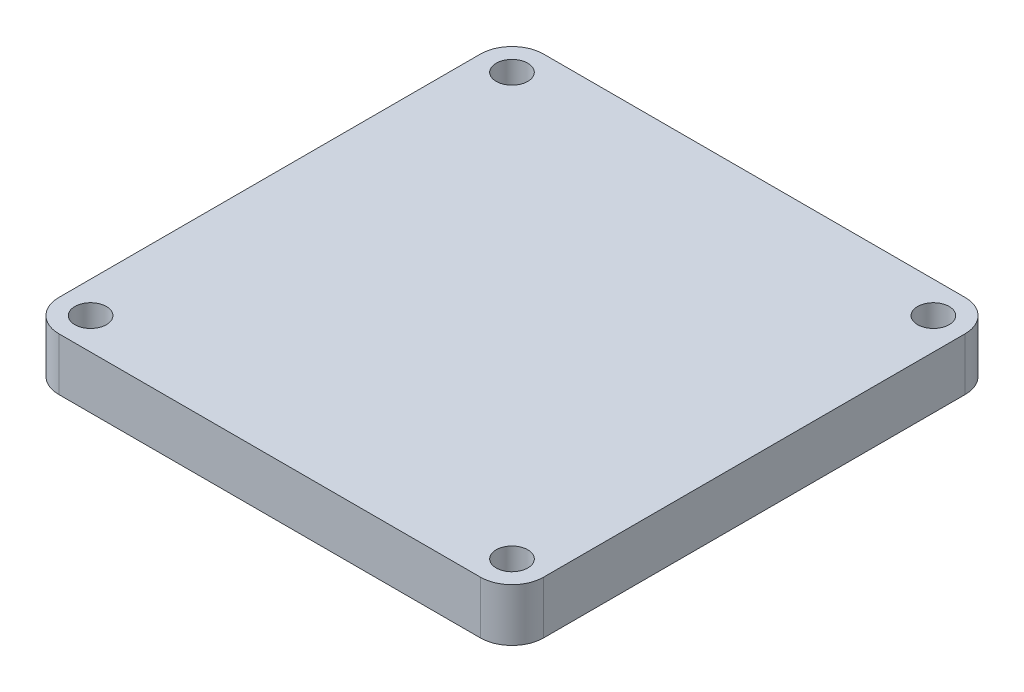
ISO-10303-21;
HEADER;
FILE_DESCRIPTION(('STEP AP214'),'2;1');
FILE_NAME('part.step','',(''),(''),'','','');
FILE_SCHEMA(('AUTOMOTIVE_DESIGN { 1 0 10303 214 1 1 1 1 }'));
ENDSEC;
DATA;
#1=APPLICATION_CONTEXT('core data for automotive mechanical design processes');
#2=APPLICATION_PROTOCOL_DEFINITION('international standard','automotive_design',2000,#1);
#3=PRODUCT_CONTEXT('',#1,'mechanical');
#4=PRODUCT('Part','Part','',(#3));
#5=PRODUCT_RELATED_PRODUCT_CATEGORY('part','',(#4));
#6=PRODUCT_DEFINITION_FORMATION('','',#4);
#7=PRODUCT_DEFINITION_CONTEXT('part definition',#1,'design');
#8=PRODUCT_DEFINITION('design','',#6,#7);
#9=PRODUCT_DEFINITION_SHAPE('','',#8);
#10=(LENGTH_UNIT() NAMED_UNIT(*) SI_UNIT(.MILLI.,.METRE.));
#11=(NAMED_UNIT(*) PLANE_ANGLE_UNIT() SI_UNIT($,.RADIAN.));
#12=(NAMED_UNIT(*) SI_UNIT($,.STERADIAN.) SOLID_ANGLE_UNIT());
#13=UNCERTAINTY_MEASURE_WITH_UNIT(LENGTH_MEASURE(1.E-05),#10,'distance_accuracy_value','');
#14=(GEOMETRIC_REPRESENTATION_CONTEXT(3) GLOBAL_UNCERTAINTY_ASSIGNED_CONTEXT((#13)) GLOBAL_UNIT_ASSIGNED_CONTEXT((#10,
#11,#12)) REPRESENTATION_CONTEXT('',''));
#15=CARTESIAN_POINT('',(0.,0.,0.));
#16=DIRECTION('',(0.,0.,1.));
#17=DIRECTION('',(1.,0.,0.));
#18=AXIS2_PLACEMENT_3D('',#15,#16,#17);
#19=CARTESIAN_POINT('',(-20.,5.,20.));
#20=DIRECTION('',(0.,-1.,0.));
#21=DIRECTION('',(0.,0.,-1.));
#22=AXIS2_PLACEMENT_3D('',#19,#20,#21);
#23=PLANE('',#22);
#24=CARTESIAN_POINT('',(-20.,5.,20.));
#25=DIRECTION('',(0.,1.,0.));
#26=DIRECTION('',(0.,0.,-1.));
#27=AXIS2_PLACEMENT_3D('',#24,#25,#26);
#28=CIRCLE('',#27,3.);
#29=CARTESIAN_POINT('',(-23.,5.,20.));
#30=VERTEX_POINT('',#29);
#31=CARTESIAN_POINT('',(-20.,5.,23.));
#32=VERTEX_POINT('',#31);
#33=EDGE_CURVE('E144',#30,#32,#28,.T.);
#34=ORIENTED_EDGE('',*,*,#33,.T.);
#35=DIRECTION('',(1.,0.,0.));
#36=VECTOR('',#35,1.);
#37=CARTESIAN_POINT('',(20.,5.,23.));
#38=LINE('',#37,#36);
#39=CARTESIAN_POINT('',(20.,5.,23.));
#40=VERTEX_POINT('',#39);
#41=EDGE_CURVE('E92',#32,#40,#38,.T.);
#42=ORIENTED_EDGE('',*,*,#41,.T.);
#43=CARTESIAN_POINT('',(20.,5.,20.));
#44=DIRECTION('',(0.,1.,0.));
#45=DIRECTION('',(0.,0.,1.));
#46=AXIS2_PLACEMENT_3D('',#43,#44,#45);
#47=CIRCLE('',#46,3.);
#48=CARTESIAN_POINT('',(23.,5.,20.));
#49=VERTEX_POINT('',#48);
#50=EDGE_CURVE('E159',#40,#49,#47,.T.);
#51=ORIENTED_EDGE('',*,*,#50,.T.);
#52=DIRECTION('',(0.,0.,-1.));
#53=VECTOR('',#52,1.);
#54=CARTESIAN_POINT('',(23.,5.,20.));
#55=LINE('',#54,#53);
#56=CARTESIAN_POINT('',(23.,5.,-20.));
#57=VERTEX_POINT('',#56);
#58=EDGE_CURVE('E172',#49,#57,#55,.T.);
#59=ORIENTED_EDGE('',*,*,#58,.T.);
#60=CARTESIAN_POINT('',(20.,5.,-20.));
#61=DIRECTION('',(0.,1.,0.));
#62=DIRECTION('',(0.,0.,1.));
#63=AXIS2_PLACEMENT_3D('',#60,#61,#62);
#64=CIRCLE('',#63,3.);
#65=CARTESIAN_POINT('',(20.,5.,-23.));
#66=VERTEX_POINT('',#65);
#67=EDGE_CURVE('E111',#57,#66,#64,.T.);
#68=ORIENTED_EDGE('',*,*,#67,.T.);
#69=DIRECTION('',(-1.,0.,0.));
#70=VECTOR('',#69,1.);
#71=CARTESIAN_POINT('',(20.,5.,-23.));
#72=LINE('',#71,#70);
#73=CARTESIAN_POINT('',(-20.,5.,-23.));
#74=VERTEX_POINT('',#73);
#75=EDGE_CURVE('E105',#66,#74,#72,.T.);
#76=ORIENTED_EDGE('',*,*,#75,.T.);
#77=CARTESIAN_POINT('',(-20.,5.,-20.));
#78=DIRECTION('',(0.,1.,0.));
#79=DIRECTION('',(0.,0.,1.));
#80=AXIS2_PLACEMENT_3D('',#77,#78,#79);
#81=CIRCLE('',#80,3.);
#82=CARTESIAN_POINT('',(-23.,5.,-20.));
#83=VERTEX_POINT('',#82);
#84=EDGE_CURVE('E109',#74,#83,#81,.T.);
#85=ORIENTED_EDGE('',*,*,#84,.T.);
#86=DIRECTION('',(0.,0.,1.));
#87=VECTOR('',#86,1.);
#88=CARTESIAN_POINT('',(-23.,5.,20.));
#89=LINE('',#88,#87);
#90=EDGE_CURVE('E49',#83,#30,#89,.T.);
#91=ORIENTED_EDGE('',*,*,#90,.T.);
#92=EDGE_LOOP('',(#34,#42,#51,#59,#68,#76,#85,#91));
#93=FACE_BOUND('',#92,.T.);
#94=CARTESIAN_POINT('',(-20.,5.,-20.));
#95=DIRECTION('',(0.,1.,0.));
#96=DIRECTION('',(0.,0.,1.));
#97=AXIS2_PLACEMENT_3D('',#94,#95,#96);
#98=CIRCLE('',#97,1.5);
#99=CARTESIAN_POINT('',(-20.,5.,-18.5));
#100=VERTEX_POINT('',#99);
#101=EDGE_CURVE('E133',#100,#100,#98,.T.);
#102=ORIENTED_EDGE('',*,*,#101,.F.);
#103=EDGE_LOOP('',(#102));
#104=FACE_BOUND('',#103,.T.);
#105=CARTESIAN_POINT('',(-20.,5.,20.));
#106=DIRECTION('',(0.,1.,0.));
#107=DIRECTION('',(0.,0.,-1.));
#108=AXIS2_PLACEMENT_3D('',#105,#106,#107);
#109=CIRCLE('',#108,1.5);
#110=CARTESIAN_POINT('',(-20.,5.,18.5));
#111=VERTEX_POINT('',#110);
#112=EDGE_CURVE('E181',#111,#111,#109,.T.);
#113=ORIENTED_EDGE('',*,*,#112,.F.);
#114=EDGE_LOOP('',(#113));
#115=FACE_BOUND('',#114,.T.);
#116=CARTESIAN_POINT('',(20.,5.,20.));
#117=DIRECTION('',(0.,1.,0.));
#118=DIRECTION('',(0.,0.,1.));
#119=AXIS2_PLACEMENT_3D('',#116,#117,#118);
#120=CIRCLE('',#119,1.50000000000001);
#121=CARTESIAN_POINT('',(20.,5.,21.5));
#122=VERTEX_POINT('',#121);
#123=EDGE_CURVE('E187',#122,#122,#120,.T.);
#124=ORIENTED_EDGE('',*,*,#123,.F.);
#125=EDGE_LOOP('',(#124));
#126=FACE_BOUND('',#125,.T.);
#127=CARTESIAN_POINT('',(20.,5.,-20.));
#128=DIRECTION('',(0.,1.,0.));
#129=DIRECTION('',(0.,0.,-1.));
#130=AXIS2_PLACEMENT_3D('',#127,#128,#129);
#131=CIRCLE('',#130,1.50000000000001);
#132=CARTESIAN_POINT('',(20.,5.,-21.5));
#133=VERTEX_POINT('',#132);
#134=EDGE_CURVE('E193',#133,#133,#131,.T.);
#135=ORIENTED_EDGE('',*,*,#134,.F.);
#136=EDGE_LOOP('',(#135));
#137=FACE_BOUND('',#136,.T.);
#138=ADVANCED_FACE('F32',(#93,#104,#115,#126,#137),#23,.F.);
#139=CARTESIAN_POINT('',(-20.,0.,20.));
#140=DIRECTION('',(0.,-1.,0.));
#141=DIRECTION('',(0.,0.,-1.));
#142=AXIS2_PLACEMENT_3D('',#139,#140,#141);
#143=PLANE('',#142);
#144=CARTESIAN_POINT('',(20.,0.,20.));
#145=DIRECTION('',(0.,1.,0.));
#146=DIRECTION('',(0.,0.,1.));
#147=AXIS2_PLACEMENT_3D('',#144,#145,#146);
#148=CIRCLE('',#147,1.50000000000001);
#149=CARTESIAN_POINT('',(20.,0.,21.5));
#150=VERTEX_POINT('',#149);
#151=EDGE_CURVE('E190',#150,#150,#148,.T.);
#152=ORIENTED_EDGE('',*,*,#151,.T.);
#153=EDGE_LOOP('',(#152));
#154=FACE_BOUND('',#153,.T.);
#155=CARTESIAN_POINT('',(-20.,0.,-20.));
#156=DIRECTION('',(0.,1.,0.));
#157=DIRECTION('',(0.,0.,1.));
#158=AXIS2_PLACEMENT_3D('',#155,#156,#157);
#159=CIRCLE('',#158,1.5);
#160=CARTESIAN_POINT('',(-20.,0.,-18.5));
#161=VERTEX_POINT('',#160);
#162=EDGE_CURVE('E178',#161,#161,#159,.T.);
#163=ORIENTED_EDGE('',*,*,#162,.T.);
#164=EDGE_LOOP('',(#163));
#165=FACE_BOUND('',#164,.T.);
#166=CARTESIAN_POINT('',(-20.,0.,20.));
#167=DIRECTION('',(0.,1.,0.));
#168=DIRECTION('',(0.,0.,-1.));
#169=AXIS2_PLACEMENT_3D('',#166,#167,#168);
#170=CIRCLE('',#169,3.);
#171=CARTESIAN_POINT('',(-23.,0.,20.));
#172=VERTEX_POINT('',#171);
#173=CARTESIAN_POINT('',(-20.,0.,23.));
#174=VERTEX_POINT('',#173);
#175=EDGE_CURVE('E129',#172,#174,#170,.T.);
#176=ORIENTED_EDGE('',*,*,#175,.F.);
#177=DIRECTION('',(0.,0.,1.));
#178=VECTOR('',#177,1.);
#179=CARTESIAN_POINT('',(-23.,0.,20.));
#180=LINE('',#179,#178);
#181=CARTESIAN_POINT('',(-23.,0.,-20.));
#182=VERTEX_POINT('',#181);
#183=EDGE_CURVE('E84',#182,#172,#180,.T.);
#184=ORIENTED_EDGE('',*,*,#183,.F.);
#185=CARTESIAN_POINT('',(-20.,0.,-20.));
#186=DIRECTION('',(0.,1.,0.));
#187=DIRECTION('',(0.,0.,1.));
#188=AXIS2_PLACEMENT_3D('',#185,#186,#187);
#189=CIRCLE('',#188,3.);
#190=CARTESIAN_POINT('',(-20.,0.,-23.));
#191=VERTEX_POINT('',#190);
#192=EDGE_CURVE('E78',#191,#182,#189,.T.);
#193=ORIENTED_EDGE('',*,*,#192,.F.);
#194=DIRECTION('',(-1.,0.,0.));
#195=VECTOR('',#194,1.);
#196=CARTESIAN_POINT('',(20.,0.,-23.));
#197=LINE('',#196,#195);
#198=CARTESIAN_POINT('',(20.,0.,-23.));
#199=VERTEX_POINT('',#198);
#200=EDGE_CURVE('E119',#199,#191,#197,.T.);
#201=ORIENTED_EDGE('',*,*,#200,.F.);
#202=CARTESIAN_POINT('',(20.,0.,-20.));
#203=DIRECTION('',(0.,1.,0.));
#204=DIRECTION('',(0.,0.,1.));
#205=AXIS2_PLACEMENT_3D('',#202,#203,#204);
#206=CIRCLE('',#205,3.);
#207=CARTESIAN_POINT('',(23.,0.,-20.));
#208=VERTEX_POINT('',#207);
#209=EDGE_CURVE('E139',#208,#199,#206,.T.);
#210=ORIENTED_EDGE('',*,*,#209,.F.);
#211=DIRECTION('',(0.,0.,-1.));
#212=VECTOR('',#211,1.);
#213=CARTESIAN_POINT('',(23.,0.,20.));
#214=LINE('',#213,#212);
#215=CARTESIAN_POINT('',(23.,0.,20.));
#216=VERTEX_POINT('',#215);
#217=EDGE_CURVE('E137',#216,#208,#214,.T.);
#218=ORIENTED_EDGE('',*,*,#217,.F.);
#219=CARTESIAN_POINT('',(20.,0.,20.));
#220=DIRECTION('',(0.,1.,0.));
#221=DIRECTION('',(0.,0.,1.));
#222=AXIS2_PLACEMENT_3D('',#219,#220,#221);
#223=CIRCLE('',#222,3.);
#224=CARTESIAN_POINT('',(20.,0.,23.));
#225=VERTEX_POINT('',#224);
#226=EDGE_CURVE('E135',#225,#216,#223,.T.);
#227=ORIENTED_EDGE('',*,*,#226,.F.);
#228=DIRECTION('',(1.,0.,0.));
#229=VECTOR('',#228,1.);
#230=CARTESIAN_POINT('',(20.,0.,23.));
#231=LINE('',#230,#229);
#232=EDGE_CURVE('E132',#174,#225,#231,.T.);
#233=ORIENTED_EDGE('',*,*,#232,.F.);
#234=EDGE_LOOP('',(#176,#184,#193,#201,#210,#218,#227,#233));
#235=FACE_BOUND('',#234,.T.);
#236=CARTESIAN_POINT('',(-20.,0.,20.));
#237=DIRECTION('',(0.,1.,0.));
#238=DIRECTION('',(0.,0.,-1.));
#239=AXIS2_PLACEMENT_3D('',#236,#237,#238);
#240=CIRCLE('',#239,1.5);
#241=CARTESIAN_POINT('',(-20.,0.,18.5));
#242=VERTEX_POINT('',#241);
#243=EDGE_CURVE('E184',#242,#242,#240,.T.);
#244=ORIENTED_EDGE('',*,*,#243,.T.);
#245=EDGE_LOOP('',(#244));
#246=FACE_BOUND('',#245,.T.);
#247=CARTESIAN_POINT('',(20.,0.,-20.));
#248=DIRECTION('',(0.,1.,0.));
#249=DIRECTION('',(0.,0.,-1.));
#250=AXIS2_PLACEMENT_3D('',#247,#248,#249);
#251=CIRCLE('',#250,1.50000000000001);
#252=CARTESIAN_POINT('',(20.,0.,-21.5));
#253=VERTEX_POINT('',#252);
#254=EDGE_CURVE('E196',#253,#253,#251,.T.);
#255=ORIENTED_EDGE('',*,*,#254,.T.);
#256=EDGE_LOOP('',(#255));
#257=FACE_BOUND('',#256,.T.);
#258=ADVANCED_FACE('F163',(#154,#165,#235,#246,#257),#143,.T.);
#259=CARTESIAN_POINT('',(-20.,5.,20.));
#260=DIRECTION('',(0.,-1.,0.));
#261=DIRECTION('',(0.,0.,-1.));
#262=AXIS2_PLACEMENT_3D('',#259,#260,#261);
#263=CYLINDRICAL_SURFACE('',#262,3.);
#264=ORIENTED_EDGE('',*,*,#175,.T.);
#265=DIRECTION('',(0.,-1.,0.));
#266=VECTOR('',#265,1.);
#267=CARTESIAN_POINT('',(-20.,5.,23.));
#268=LINE('',#267,#266);
#269=EDGE_CURVE('E11',#32,#174,#268,.T.);
#270=ORIENTED_EDGE('',*,*,#269,.F.);
#271=ORIENTED_EDGE('',*,*,#33,.F.);
#272=DIRECTION('',(0.,-1.,0.));
#273=VECTOR('',#272,1.);
#274=CARTESIAN_POINT('',(-23.,5.,20.));
#275=LINE('',#274,#273);
#276=EDGE_CURVE('E125',#30,#172,#275,.T.);
#277=ORIENTED_EDGE('',*,*,#276,.T.);
#278=EDGE_LOOP('',(#264,#270,#271,#277));
#279=FACE_BOUND('',#278,.T.);
#280=ADVANCED_FACE('F34',(#279),#263,.T.);
#281=CARTESIAN_POINT('',(20.,5.,23.));
#282=DIRECTION('',(0.,0.,-1.));
#283=DIRECTION('',(-1.,0.,0.));
#284=AXIS2_PLACEMENT_3D('',#281,#282,#283);
#285=PLANE('',#284);
#286=ORIENTED_EDGE('',*,*,#232,.T.);
#287=DIRECTION('',(0.,-1.,0.));
#288=VECTOR('',#287,1.);
#289=CARTESIAN_POINT('',(20.,5.,23.));
#290=LINE('',#289,#288);
#291=EDGE_CURVE('E41',#40,#225,#290,.T.);
#292=ORIENTED_EDGE('',*,*,#291,.F.);
#293=ORIENTED_EDGE('',*,*,#41,.F.);
#294=ORIENTED_EDGE('',*,*,#269,.T.);
#295=EDGE_LOOP('',(#286,#292,#293,#294));
#296=FACE_BOUND('',#295,.T.);
#297=ADVANCED_FACE('F228',(#296),#285,.F.);
#298=CARTESIAN_POINT('',(20.,5.,20.));
#299=DIRECTION('',(0.,-1.,0.));
#300=DIRECTION('',(0.,0.,-1.));
#301=AXIS2_PLACEMENT_3D('',#298,#299,#300);
#302=CYLINDRICAL_SURFACE('',#301,3.);
#303=ORIENTED_EDGE('',*,*,#226,.T.);
#304=DIRECTION('',(0.,-1.,0.));
#305=VECTOR('',#304,1.);
#306=CARTESIAN_POINT('',(23.,5.,20.));
#307=LINE('',#306,#305);
#308=EDGE_CURVE('E151',#49,#216,#307,.T.);
#309=ORIENTED_EDGE('',*,*,#308,.F.);
#310=ORIENTED_EDGE('',*,*,#50,.F.);
#311=ORIENTED_EDGE('',*,*,#291,.T.);
#312=EDGE_LOOP('',(#303,#309,#310,#311));
#313=FACE_BOUND('',#312,.T.);
#314=ADVANCED_FACE('F157',(#313),#302,.T.);
#315=CARTESIAN_POINT('',(23.,5.,20.));
#316=DIRECTION('',(-1.,0.,0.));
#317=DIRECTION('',(0.,0.,1.));
#318=AXIS2_PLACEMENT_3D('',#315,#316,#317);
#319=PLANE('',#318);
#320=ORIENTED_EDGE('',*,*,#217,.T.);
#321=DIRECTION('',(0.,-1.,0.));
#322=VECTOR('',#321,1.);
#323=CARTESIAN_POINT('',(23.,5.,-20.));
#324=LINE('',#323,#322);
#325=EDGE_CURVE('E148',#57,#208,#324,.T.);
#326=ORIENTED_EDGE('',*,*,#325,.F.);
#327=ORIENTED_EDGE('',*,*,#58,.F.);
#328=ORIENTED_EDGE('',*,*,#308,.T.);
#329=EDGE_LOOP('',(#320,#326,#327,#328));
#330=FACE_BOUND('',#329,.T.);
#331=ADVANCED_FACE('F168',(#330),#319,.F.);
#332=CARTESIAN_POINT('',(20.,5.,-20.));
#333=DIRECTION('',(0.,-1.,0.));
#334=DIRECTION('',(0.,0.,-1.));
#335=AXIS2_PLACEMENT_3D('',#332,#333,#334);
#336=CYLINDRICAL_SURFACE('',#335,3.);
#337=ORIENTED_EDGE('',*,*,#209,.T.);
#338=DIRECTION('',(0.,-1.,0.));
#339=VECTOR('',#338,1.);
#340=CARTESIAN_POINT('',(20.,5.,-23.));
#341=LINE('',#340,#339);
#342=EDGE_CURVE('E120',#66,#199,#341,.T.);
#343=ORIENTED_EDGE('',*,*,#342,.F.);
#344=ORIENTED_EDGE('',*,*,#67,.F.);
#345=ORIENTED_EDGE('',*,*,#325,.T.);
#346=EDGE_LOOP('',(#337,#343,#344,#345));
#347=FACE_BOUND('',#346,.T.);
#348=ADVANCED_FACE('F171',(#347),#336,.T.);
#349=CARTESIAN_POINT('',(20.,5.,-23.));
#350=DIRECTION('',(0.,0.,1.));
#351=DIRECTION('',(1.,0.,0.));
#352=AXIS2_PLACEMENT_3D('',#349,#350,#351);
#353=PLANE('',#352);
#354=ORIENTED_EDGE('',*,*,#200,.T.);
#355=DIRECTION('',(0.,-1.,0.));
#356=VECTOR('',#355,1.);
#357=CARTESIAN_POINT('',(-20.,5.,-23.));
#358=LINE('',#357,#356);
#359=EDGE_CURVE('E116',#74,#191,#358,.T.);
#360=ORIENTED_EDGE('',*,*,#359,.F.);
#361=ORIENTED_EDGE('',*,*,#75,.F.);
#362=ORIENTED_EDGE('',*,*,#342,.T.);
#363=EDGE_LOOP('',(#354,#360,#361,#362));
#364=FACE_BOUND('',#363,.T.);
#365=ADVANCED_FACE('F117',(#364),#353,.F.);
#366=CARTESIAN_POINT('',(-20.,5.,-20.));
#367=DIRECTION('',(0.,-1.,0.));
#368=DIRECTION('',(0.,0.,-1.));
#369=AXIS2_PLACEMENT_3D('',#366,#367,#368);
#370=CYLINDRICAL_SURFACE('',#369,3.);
#371=ORIENTED_EDGE('',*,*,#192,.T.);
#372=DIRECTION('',(0.,-1.,0.));
#373=VECTOR('',#372,1.);
#374=CARTESIAN_POINT('',(-23.,5.,-20.));
#375=LINE('',#374,#373);
#376=EDGE_CURVE('E121',#83,#182,#375,.T.);
#377=ORIENTED_EDGE('',*,*,#376,.F.);
#378=ORIENTED_EDGE('',*,*,#84,.F.);
#379=ORIENTED_EDGE('',*,*,#359,.T.);
#380=EDGE_LOOP('',(#371,#377,#378,#379));
#381=FACE_BOUND('',#380,.T.);
#382=ADVANCED_FACE('F123',(#381),#370,.T.);
#383=CARTESIAN_POINT('',(-23.,5.,20.));
#384=DIRECTION('',(1.,0.,0.));
#385=DIRECTION('',(0.,0.,-1.));
#386=AXIS2_PLACEMENT_3D('',#383,#384,#385);
#387=PLANE('',#386);
#388=ORIENTED_EDGE('',*,*,#183,.T.);
#389=ORIENTED_EDGE('',*,*,#276,.F.);
#390=ORIENTED_EDGE('',*,*,#90,.F.);
#391=ORIENTED_EDGE('',*,*,#376,.T.);
#392=EDGE_LOOP('',(#388,#389,#390,#391));
#393=FACE_BOUND('',#392,.T.);
#394=ADVANCED_FACE('F216',(#393),#387,.F.);
#395=CARTESIAN_POINT('',(-20.,5.,-20.));
#396=DIRECTION('',(0.,-1.,0.));
#397=DIRECTION('',(0.,0.,-1.));
#398=AXIS2_PLACEMENT_3D('',#395,#396,#397);
#399=CYLINDRICAL_SURFACE('',#398,1.5);
#400=ORIENTED_EDGE('',*,*,#101,.T.);
#401=EDGE_LOOP('',(#400));
#402=FACE_BOUND('',#401,.T.);
#403=ORIENTED_EDGE('',*,*,#162,.F.);
#404=EDGE_LOOP('',(#403));
#405=FACE_BOUND('',#404,.T.);
#406=ADVANCED_FACE('F213',(#402,#405),#399,.F.);
#407=CARTESIAN_POINT('',(-20.,5.,20.));
#408=DIRECTION('',(0.,-1.,0.));
#409=DIRECTION('',(0.,0.,-1.));
#410=AXIS2_PLACEMENT_3D('',#407,#408,#409);
#411=CYLINDRICAL_SURFACE('',#410,1.5);
#412=ORIENTED_EDGE('',*,*,#112,.T.);
#413=EDGE_LOOP('',(#412));
#414=FACE_BOUND('',#413,.T.);
#415=ORIENTED_EDGE('',*,*,#243,.F.);
#416=EDGE_LOOP('',(#415));
#417=FACE_BOUND('',#416,.T.);
#418=ADVANCED_FACE('F292',(#414,#417),#411,.F.);
#419=CARTESIAN_POINT('',(20.,5.,20.));
#420=DIRECTION('',(0.,-1.,0.));
#421=DIRECTION('',(0.,0.,-1.));
#422=AXIS2_PLACEMENT_3D('',#419,#420,#421);
#423=CYLINDRICAL_SURFACE('',#422,1.50000000000001);
#424=ORIENTED_EDGE('',*,*,#123,.T.);
#425=EDGE_LOOP('',(#424));
#426=FACE_BOUND('',#425,.T.);
#427=ORIENTED_EDGE('',*,*,#151,.F.);
#428=EDGE_LOOP('',(#427));
#429=FACE_BOUND('',#428,.T.);
#430=ADVANCED_FACE('F300',(#426,#429),#423,.F.);
#431=CARTESIAN_POINT('',(20.,5.,-20.));
#432=DIRECTION('',(0.,-1.,0.));
#433=DIRECTION('',(0.,0.,-1.));
#434=AXIS2_PLACEMENT_3D('',#431,#432,#433);
#435=CYLINDRICAL_SURFACE('',#434,1.50000000000001);
#436=ORIENTED_EDGE('',*,*,#134,.T.);
#437=EDGE_LOOP('',(#436));
#438=FACE_BOUND('',#437,.T.);
#439=ORIENTED_EDGE('',*,*,#254,.F.);
#440=EDGE_LOOP('',(#439));
#441=FACE_BOUND('',#440,.T.);
#442=ADVANCED_FACE('F202',(#438,#441),#435,.F.);
#443=CLOSED_SHELL('',(#138,#258,#280,#297,#314,#331,#348,#365,#382,#394,#406,#418,#430,#442));
#444=MANIFOLD_SOLID_BREP('B2',#443);
#445=ADVANCED_BREP_SHAPE_REPRESENTATION('',(#18,#444),#14);
#446=SHAPE_DEFINITION_REPRESENTATION(#9,#445);
ENDSEC;
END-ISO-10303-21;
